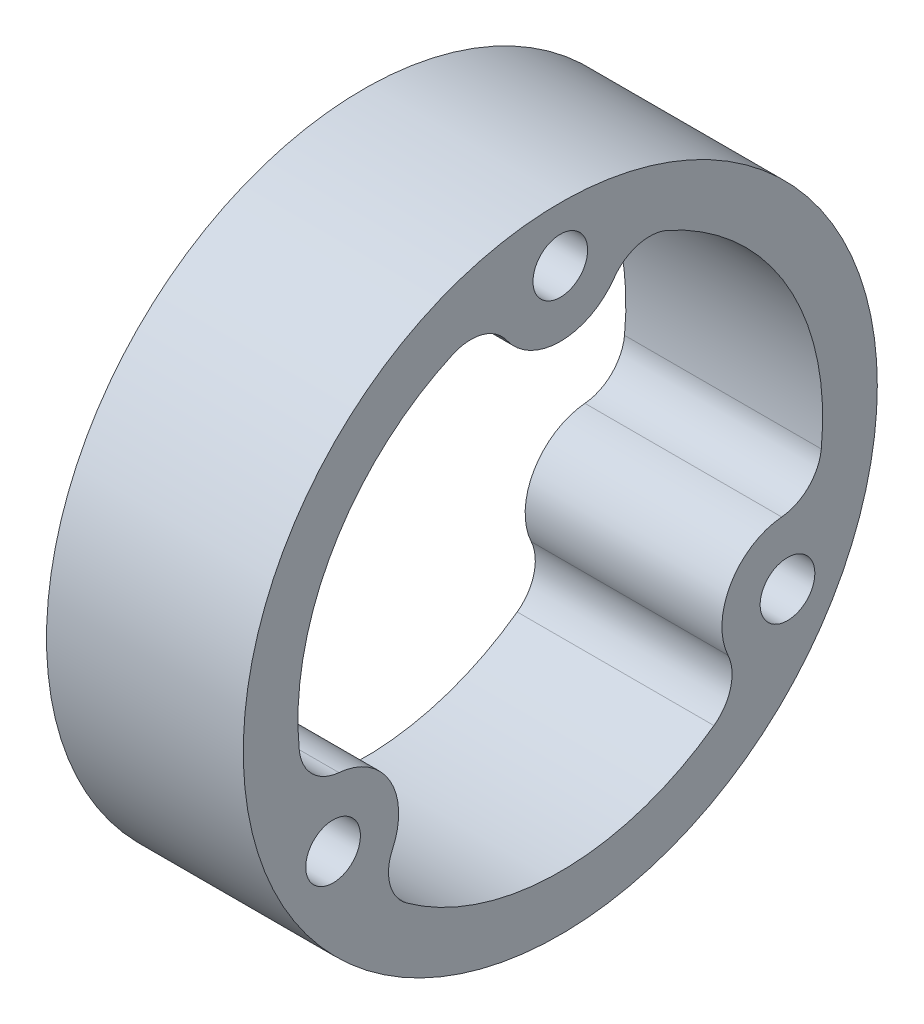
ISO-10303-21;
HEADER;
FILE_DESCRIPTION(('STEP AP214'),'2;1');
FILE_NAME('part.step','',(''),(''),'','','');
FILE_SCHEMA(('AUTOMOTIVE_DESIGN { 1 0 10303 214 1 1 1 1 }'));
ENDSEC;
DATA;
#1=APPLICATION_CONTEXT('core data for automotive mechanical design processes');
#2=APPLICATION_PROTOCOL_DEFINITION('international standard','automotive_design',2000,#1);
#3=PRODUCT_CONTEXT('',#1,'mechanical');
#4=PRODUCT('Part','Part','',(#3));
#5=PRODUCT_RELATED_PRODUCT_CATEGORY('part','',(#4));
#6=PRODUCT_DEFINITION_FORMATION('','',#4);
#7=PRODUCT_DEFINITION_CONTEXT('part definition',#1,'design');
#8=PRODUCT_DEFINITION('design','',#6,#7);
#9=PRODUCT_DEFINITION_SHAPE('','',#8);
#10=(LENGTH_UNIT() NAMED_UNIT(*) SI_UNIT(.MILLI.,.METRE.));
#11=(NAMED_UNIT(*) PLANE_ANGLE_UNIT() SI_UNIT($,.RADIAN.));
#12=(NAMED_UNIT(*) SI_UNIT($,.STERADIAN.) SOLID_ANGLE_UNIT());
#13=UNCERTAINTY_MEASURE_WITH_UNIT(LENGTH_MEASURE(1.E-05),#10,'distance_accuracy_value','');
#14=(GEOMETRIC_REPRESENTATION_CONTEXT(3) GLOBAL_UNCERTAINTY_ASSIGNED_CONTEXT((#13)) GLOBAL_UNIT_ASSIGNED_CONTEXT((#10,
#11,#12)) REPRESENTATION_CONTEXT('',''));
#15=CARTESIAN_POINT('',(0.,0.,0.));
#16=DIRECTION('',(0.,0.,1.));
#17=DIRECTION('',(1.,0.,0.));
#18=AXIS2_PLACEMENT_3D('',#15,#16,#17);
#19=CARTESIAN_POINT('',(9.,0.,0.));
#20=DIRECTION('',(1.,0.,0.));
#21=DIRECTION('',(0.,0.,-1.));
#22=AXIS2_PLACEMENT_3D('',#19,#20,#21);
#23=PLANE('',#22);
#24=CARTESIAN_POINT('',(9.,12.,0.));
#25=DIRECTION('',(1.,0.,0.));
#26=DIRECTION('',(0.,0.,-1.));
#27=AXIS2_PLACEMENT_3D('',#24,#25,#26);
#28=CIRCLE('',#27,1.25);
#29=CARTESIAN_POINT('',(9.,12.,-1.25));
#30=VERTEX_POINT('',#29);
#31=EDGE_CURVE('E233',#30,#30,#28,.T.);
#32=ORIENTED_EDGE('',*,*,#31,.F.);
#33=EDGE_LOOP('',(#32));
#34=FACE_BOUND('',#33,.T.);
#35=CARTESIAN_POINT('',(9.,0.,0.));
#36=DIRECTION('',(1.,0.,0.));
#37=DIRECTION('',(0.,0.,-1.));
#38=AXIS2_PLACEMENT_3D('',#35,#36,#37);
#39=CIRCLE('',#38,14.5);
#40=CARTESIAN_POINT('',(9.,0.,-14.5));
#41=VERTEX_POINT('',#40);
#42=EDGE_CURVE('E149',#41,#41,#39,.T.);
#43=ORIENTED_EDGE('',*,*,#42,.T.);
#44=EDGE_LOOP('',(#43));
#45=FACE_BOUND('',#44,.T.);
#46=CARTESIAN_POINT('',(9.,-6.,-10.3923048454133));
#47=DIRECTION('',(1.,0.,0.));
#48=DIRECTION('',(0.,0.,-1.));
#49=AXIS2_PLACEMENT_3D('',#46,#47,#48);
#50=CIRCLE('',#49,1.25000000000005);
#51=CARTESIAN_POINT('',(9.,-6.,-11.6423048454133));
#52=VERTEX_POINT('',#51);
#53=EDGE_CURVE('E240',#52,#52,#50,.T.);
#54=ORIENTED_EDGE('',*,*,#53,.F.);
#55=EDGE_LOOP('',(#54));
#56=FACE_BOUND('',#55,.T.);
#57=CARTESIAN_POINT('',(9.,12.,0.));
#58=DIRECTION('',(-1.,0.,0.));
#59=DIRECTION('',(0.,0.,-1.));
#60=AXIS2_PLACEMENT_3D('',#57,#58,#59);
#61=CIRCLE('',#60,3.);
#62=CARTESIAN_POINT('',(9.,10.275,-2.45446022579304));
#63=VERTEX_POINT('',#62);
#64=CARTESIAN_POINT('',(9.,10.275,2.45446022579304));
#65=VERTEX_POINT('',#64);
#66=EDGE_CURVE('E226',#63,#65,#61,.T.);
#67=ORIENTED_EDGE('',*,*,#66,.F.);
#68=CARTESIAN_POINT('',(9.,9.125,-4.09076704298839));
#69=DIRECTION('',(1.,0.,0.));
#70=DIRECTION('',(0.,0.,-1.));
#71=AXIS2_PLACEMENT_3D('',#68,#69,#70);
#72=CIRCLE('',#71,2.);
#73=CARTESIAN_POINT('',(9.,10.95,-4.90892045158607));
#74=VERTEX_POINT('',#73);
#75=EDGE_CURVE('E51',#63,#74,#72,.F.);
#76=ORIENTED_EDGE('',*,*,#75,.T.);
#77=CARTESIAN_POINT('',(9.,0.,0.));
#78=DIRECTION('',(1.,0.,0.));
#79=DIRECTION('',(0.,0.,-1.));
#80=AXIS2_PLACEMENT_3D('',#77,#78,#79);
#81=CIRCLE('',#80,12.);
#82=CARTESIAN_POINT('',(9.,-1.22375018376942,-11.9374383972326));
#83=VERTEX_POINT('',#82);
#84=EDGE_CURVE('E239',#83,#74,#81,.T.);
#85=ORIENTED_EDGE('',*,*,#84,.F.);
#86=CARTESIAN_POINT('',(9.,-1.01979181980785,-9.9478653310272));
#87=DIRECTION('',(1.,0.,0.));
#88=DIRECTION('',(0.,0.,-1.));
#89=AXIS2_PLACEMENT_3D('',#86,#87,#88);
#90=CIRCLE('',#89,2.);
#91=CARTESIAN_POINT('',(9.,-3.01187509188469,-10.1256411367816));
#92=VERTEX_POINT('',#91);
#93=EDGE_CURVE('E137',#83,#92,#90,.F.);
#94=ORIENTED_EDGE('',*,*,#93,.T.);
#95=CARTESIAN_POINT('',(9.,-6.,-10.3923048454133));
#96=DIRECTION('',(-1.,0.,0.));
#97=DIRECTION('',(0.,0.,-1.));
#98=AXIS2_PLACEMENT_3D('',#95,#96,#97);
#99=CIRCLE('',#98,3.00000000000005);
#100=CARTESIAN_POINT('',(9.,-7.26312490811529,-7.67118091098855));
#101=VERTEX_POINT('',#100);
#102=EDGE_CURVE('E223',#101,#92,#99,.T.);
#103=ORIENTED_EDGE('',*,*,#102,.F.);
#104=CARTESIAN_POINT('',(9.,-8.10520818019213,-5.85709828803876));
#105=DIRECTION('',(1.,0.,0.));
#106=DIRECTION('',(0.,0.,-1.));
#107=AXIS2_PLACEMENT_3D('',#104,#105,#106);
#108=CIRCLE('',#107,2.);
#109=CARTESIAN_POINT('',(9.,-9.72624981623056,-7.02851794564652));
#110=VERTEX_POINT('',#109);
#111=EDGE_CURVE('E190',#101,#110,#108,.F.);
#112=ORIENTED_EDGE('',*,*,#111,.T.);
#113=CARTESIAN_POINT('',(9.,0.,0.));
#114=DIRECTION('',(1.,0.,0.));
#115=DIRECTION('',(0.,0.,-1.));
#116=AXIS2_PLACEMENT_3D('',#113,#114,#115);
#117=CIRCLE('',#116,12.);
#118=CARTESIAN_POINT('',(9.,-9.7262498162306,7.02851794564646));
#119=VERTEX_POINT('',#118);
#120=EDGE_CURVE('E217',#119,#110,#117,.T.);
#121=ORIENTED_EDGE('',*,*,#120,.F.);
#122=CARTESIAN_POINT('',(9.,-8.10520818019216,5.85709828803872));
#123=DIRECTION('',(1.,0.,0.));
#124=DIRECTION('',(0.,0.,-1.));
#125=AXIS2_PLACEMENT_3D('',#122,#123,#124);
#126=CIRCLE('',#125,2.);
#127=CARTESIAN_POINT('',(9.,-7.26312490811532,7.6711809109885));
#128=VERTEX_POINT('',#127);
#129=EDGE_CURVE('E11',#119,#128,#126,.F.);
#130=ORIENTED_EDGE('',*,*,#129,.T.);
#131=CARTESIAN_POINT('',(9.,-6.00000000000001,10.3923048454133));
#132=DIRECTION('',(-1.,0.,0.));
#133=DIRECTION('',(0.,0.,-1.));
#134=AXIS2_PLACEMENT_3D('',#131,#132,#133);
#135=CIRCLE('',#134,3.00000000000011);
#136=CARTESIAN_POINT('',(9.,-3.01187509188464,10.1256411367816));
#137=VERTEX_POINT('',#136);
#138=EDGE_CURVE('E215',#137,#128,#135,.T.);
#139=ORIENTED_EDGE('',*,*,#138,.F.);
#140=CARTESIAN_POINT('',(9.,-1.0197918198078,9.94786533102721));
#141=DIRECTION('',(1.,0.,0.));
#142=DIRECTION('',(0.,0.,-1.));
#143=AXIS2_PLACEMENT_3D('',#140,#141,#142);
#144=CIRCLE('',#143,2.);
#145=CARTESIAN_POINT('',(9.,-1.22375018376936,11.9374383972327));
#146=VERTEX_POINT('',#145);
#147=EDGE_CURVE('E186',#137,#146,#144,.F.);
#148=ORIENTED_EDGE('',*,*,#147,.T.);
#149=CARTESIAN_POINT('',(9.,0.,0.));
#150=DIRECTION('',(1.,0.,0.));
#151=DIRECTION('',(0.,0.,-1.));
#152=AXIS2_PLACEMENT_3D('',#149,#150,#151);
#153=CIRCLE('',#152,12.);
#154=CARTESIAN_POINT('',(9.,10.95,4.90892045158607));
#155=VERTEX_POINT('',#154);
#156=EDGE_CURVE('E221',#155,#146,#153,.T.);
#157=ORIENTED_EDGE('',*,*,#156,.F.);
#158=CARTESIAN_POINT('',(9.,9.125,4.09076704298839));
#159=DIRECTION('',(1.,0.,0.));
#160=DIRECTION('',(0.,0.,-1.));
#161=AXIS2_PLACEMENT_3D('',#158,#159,#160);
#162=CIRCLE('',#161,2.);
#163=EDGE_CURVE('E182',#155,#65,#162,.F.);
#164=ORIENTED_EDGE('',*,*,#163,.T.);
#165=EDGE_LOOP('',(#67,#76,#85,#94,#103,#112,#121,#130,#139,#148,#157,#164));
#166=FACE_BOUND('',#165,.T.);
#167=CARTESIAN_POINT('',(9.,-6.00000000000001,10.3923048454133));
#168=DIRECTION('',(1.,0.,0.));
#169=DIRECTION('',(0.,0.,-1.));
#170=AXIS2_PLACEMENT_3D('',#167,#168,#169);
#171=CIRCLE('',#170,1.25000000000011);
#172=CARTESIAN_POINT('',(9.,-6.00000000000001,9.14230484541315));
#173=VERTEX_POINT('',#172);
#174=EDGE_CURVE('E419',#173,#173,#171,.T.);
#175=ORIENTED_EDGE('',*,*,#174,.F.);
#176=EDGE_LOOP('',(#175));
#177=FACE_BOUND('',#176,.T.);
#178=ADVANCED_FACE('F36',(#34,#45,#56,#166,#177),#23,.T.);
#179=CARTESIAN_POINT('',(0.,0.,0.));
#180=DIRECTION('',(1.,0.,0.));
#181=DIRECTION('',(0.,0.,-1.));
#182=AXIS2_PLACEMENT_3D('',#179,#180,#181);
#183=PLANE('',#182);
#184=CARTESIAN_POINT('',(0.,-6.,-10.3923048454133));
#185=DIRECTION('',(1.,0.,0.));
#186=DIRECTION('',(0.,0.,-1.));
#187=AXIS2_PLACEMENT_3D('',#184,#185,#186);
#188=CIRCLE('',#187,1.25000000000005);
#189=CARTESIAN_POINT('',(0.,-6.,-11.6423048454133));
#190=VERTEX_POINT('',#189);
#191=EDGE_CURVE('E232',#190,#190,#188,.T.);
#192=ORIENTED_EDGE('',*,*,#191,.T.);
#193=EDGE_LOOP('',(#192));
#194=FACE_BOUND('',#193,.T.);
#195=CARTESIAN_POINT('',(0.,0.,0.));
#196=DIRECTION('',(1.,0.,0.));
#197=DIRECTION('',(0.,0.,-1.));
#198=AXIS2_PLACEMENT_3D('',#195,#196,#197);
#199=CIRCLE('',#198,14.5);
#200=CARTESIAN_POINT('',(0.,0.,-14.5));
#201=VERTEX_POINT('',#200);
#202=EDGE_CURVE('E154',#201,#201,#199,.T.);
#203=ORIENTED_EDGE('',*,*,#202,.F.);
#204=EDGE_LOOP('',(#203));
#205=FACE_BOUND('',#204,.T.);
#206=CARTESIAN_POINT('',(0.,-6.,-10.3923048454133));
#207=DIRECTION('',(-1.,0.,0.));
#208=DIRECTION('',(0.,0.,-1.));
#209=AXIS2_PLACEMENT_3D('',#206,#207,#208);
#210=CIRCLE('',#209,3.00000000000005);
#211=CARTESIAN_POINT('',(0.,-7.26312490811529,-7.67118091098855));
#212=VERTEX_POINT('',#211);
#213=CARTESIAN_POINT('',(0.,-3.01187509188469,-10.1256411367816));
#214=VERTEX_POINT('',#213);
#215=EDGE_CURVE('E209',#212,#214,#210,.T.);
#216=ORIENTED_EDGE('',*,*,#215,.T.);
#217=CARTESIAN_POINT('',(0.,-1.01979181980785,-9.9478653310272));
#218=DIRECTION('',(1.,0.,0.));
#219=DIRECTION('',(0.,0.,-1.));
#220=AXIS2_PLACEMENT_3D('',#217,#218,#219);
#221=CIRCLE('',#220,2.);
#222=CARTESIAN_POINT('',(0.,-1.22375018376942,-11.9374383972326));
#223=VERTEX_POINT('',#222);
#224=EDGE_CURVE('E192',#214,#223,#221,.T.);
#225=ORIENTED_EDGE('',*,*,#224,.T.);
#226=CARTESIAN_POINT('',(0.,0.,0.));
#227=DIRECTION('',(1.,0.,0.));
#228=DIRECTION('',(0.,0.,-1.));
#229=AXIS2_PLACEMENT_3D('',#226,#227,#228);
#230=CIRCLE('',#229,12.);
#231=CARTESIAN_POINT('',(0.,10.95,-4.90892045158607));
#232=VERTEX_POINT('',#231);
#233=EDGE_CURVE('E132',#223,#232,#230,.T.);
#234=ORIENTED_EDGE('',*,*,#233,.T.);
#235=CARTESIAN_POINT('',(0.,9.125,-4.09076704298839));
#236=DIRECTION('',(1.,0.,0.));
#237=DIRECTION('',(0.,0.,-1.));
#238=AXIS2_PLACEMENT_3D('',#235,#236,#237);
#239=CIRCLE('',#238,2.);
#240=CARTESIAN_POINT('',(0.,10.275,-2.45446022579304));
#241=VERTEX_POINT('',#240);
#242=EDGE_CURVE('E126',#232,#241,#239,.T.);
#243=ORIENTED_EDGE('',*,*,#242,.T.);
#244=CARTESIAN_POINT('',(0.,12.,0.));
#245=DIRECTION('',(-1.,0.,0.));
#246=DIRECTION('',(0.,0.,-1.));
#247=AXIS2_PLACEMENT_3D('',#244,#245,#246);
#248=CIRCLE('',#247,3.);
#249=CARTESIAN_POINT('',(0.,10.275,2.45446022579304));
#250=VERTEX_POINT('',#249);
#251=EDGE_CURVE('E131',#241,#250,#248,.T.);
#252=ORIENTED_EDGE('',*,*,#251,.T.);
#253=CARTESIAN_POINT('',(0.,9.125,4.09076704298839));
#254=DIRECTION('',(1.,0.,0.));
#255=DIRECTION('',(0.,0.,-1.));
#256=AXIS2_PLACEMENT_3D('',#253,#254,#255);
#257=CIRCLE('',#256,2.);
#258=CARTESIAN_POINT('',(0.,10.95,4.90892045158607));
#259=VERTEX_POINT('',#258);
#260=EDGE_CURVE('E180',#250,#259,#257,.T.);
#261=ORIENTED_EDGE('',*,*,#260,.T.);
#262=CARTESIAN_POINT('',(0.,0.,0.));
#263=DIRECTION('',(1.,0.,0.));
#264=DIRECTION('',(0.,0.,-1.));
#265=AXIS2_PLACEMENT_3D('',#262,#263,#264);
#266=CIRCLE('',#265,12.);
#267=CARTESIAN_POINT('',(0.,-1.22375018376936,11.9374383972327));
#268=VERTEX_POINT('',#267);
#269=EDGE_CURVE('E146',#259,#268,#266,.T.);
#270=ORIENTED_EDGE('',*,*,#269,.T.);
#271=CARTESIAN_POINT('',(0.,-1.0197918198078,9.94786533102721));
#272=DIRECTION('',(1.,0.,0.));
#273=DIRECTION('',(0.,0.,-1.));
#274=AXIS2_PLACEMENT_3D('',#271,#272,#273);
#275=CIRCLE('',#274,2.);
#276=CARTESIAN_POINT('',(0.,-3.01187509188464,10.1256411367816));
#277=VERTEX_POINT('',#276);
#278=EDGE_CURVE('E184',#268,#277,#275,.T.);
#279=ORIENTED_EDGE('',*,*,#278,.T.);
#280=CARTESIAN_POINT('',(0.,-6.00000000000001,10.3923048454133));
#281=DIRECTION('',(-1.,0.,0.));
#282=DIRECTION('',(0.,0.,-1.));
#283=AXIS2_PLACEMENT_3D('',#280,#281,#282);
#284=CIRCLE('',#283,3.00000000000011);
#285=CARTESIAN_POINT('',(0.,-7.26312490811532,7.6711809109885));
#286=VERTEX_POINT('',#285);
#287=EDGE_CURVE('E200',#277,#286,#284,.T.);
#288=ORIENTED_EDGE('',*,*,#287,.T.);
#289=CARTESIAN_POINT('',(0.,-8.10520818019216,5.85709828803872));
#290=DIRECTION('',(1.,0.,0.));
#291=DIRECTION('',(0.,0.,-1.));
#292=AXIS2_PLACEMENT_3D('',#289,#290,#291);
#293=CIRCLE('',#292,2.);
#294=CARTESIAN_POINT('',(0.,-9.7262498162306,7.02851794564646));
#295=VERTEX_POINT('',#294);
#296=EDGE_CURVE('E44',#286,#295,#293,.T.);
#297=ORIENTED_EDGE('',*,*,#296,.T.);
#298=CARTESIAN_POINT('',(0.,0.,0.));
#299=DIRECTION('',(1.,0.,0.));
#300=DIRECTION('',(0.,0.,-1.));
#301=AXIS2_PLACEMENT_3D('',#298,#299,#300);
#302=CIRCLE('',#301,12.);
#303=CARTESIAN_POINT('',(0.,-9.72624981623056,-7.02851794564652));
#304=VERTEX_POINT('',#303);
#305=EDGE_CURVE('E198',#295,#304,#302,.T.);
#306=ORIENTED_EDGE('',*,*,#305,.T.);
#307=CARTESIAN_POINT('',(0.,-8.10520818019213,-5.85709828803876));
#308=DIRECTION('',(1.,0.,0.));
#309=DIRECTION('',(0.,0.,-1.));
#310=AXIS2_PLACEMENT_3D('',#307,#308,#309);
#311=CIRCLE('',#310,2.);
#312=EDGE_CURVE('E188',#304,#212,#311,.T.);
#313=ORIENTED_EDGE('',*,*,#312,.T.);
#314=EDGE_LOOP('',(#216,#225,#234,#243,#252,#261,#270,#279,#288,#297,#306,#313));
#315=FACE_BOUND('',#314,.T.);
#316=CARTESIAN_POINT('',(0.,12.,0.));
#317=DIRECTION('',(1.,0.,0.));
#318=DIRECTION('',(0.,0.,-1.));
#319=AXIS2_PLACEMENT_3D('',#316,#317,#318);
#320=CIRCLE('',#319,1.25);
#321=CARTESIAN_POINT('',(0.,12.,-1.25));
#322=VERTEX_POINT('',#321);
#323=EDGE_CURVE('E418',#322,#322,#320,.T.);
#324=ORIENTED_EDGE('',*,*,#323,.T.);
#325=EDGE_LOOP('',(#324));
#326=FACE_BOUND('',#325,.T.);
#327=CARTESIAN_POINT('',(0.,-6.00000000000001,10.3923048454133));
#328=DIRECTION('',(1.,0.,0.));
#329=DIRECTION('',(0.,0.,-1.));
#330=AXIS2_PLACEMENT_3D('',#327,#328,#329);
#331=CIRCLE('',#330,1.25000000000011);
#332=CARTESIAN_POINT('',(0.,-6.00000000000001,9.14230484541315));
#333=VERTEX_POINT('',#332);
#334=EDGE_CURVE('E423',#333,#333,#331,.T.);
#335=ORIENTED_EDGE('',*,*,#334,.T.);
#336=EDGE_LOOP('',(#335));
#337=FACE_BOUND('',#336,.T.);
#338=ADVANCED_FACE('F129',(#194,#205,#315,#326,#337),#183,.F.);
#339=CARTESIAN_POINT('',(9.,0.,0.));
#340=DIRECTION('',(-1.,0.,0.));
#341=DIRECTION('',(0.,0.,1.));
#342=AXIS2_PLACEMENT_3D('',#339,#340,#341);
#343=CYLINDRICAL_SURFACE('',#342,14.5);
#344=ORIENTED_EDGE('',*,*,#42,.F.);
#345=EDGE_LOOP('',(#344));
#346=FACE_BOUND('',#345,.T.);
#347=ORIENTED_EDGE('',*,*,#202,.T.);
#348=EDGE_LOOP('',(#347));
#349=FACE_BOUND('',#348,.T.);
#350=ADVANCED_FACE('F251',(#346,#349),#343,.T.);
#351=CARTESIAN_POINT('',(9.,-6.,-10.3923048454133));
#352=DIRECTION('',(-1.,0.,0.));
#353=DIRECTION('',(0.,0.,1.));
#354=AXIS2_PLACEMENT_3D('',#351,#352,#353);
#355=CYLINDRICAL_SURFACE('',#354,1.25000000000005);
#356=ORIENTED_EDGE('',*,*,#53,.T.);
#357=EDGE_LOOP('',(#356));
#358=FACE_BOUND('',#357,.T.);
#359=ORIENTED_EDGE('',*,*,#191,.F.);
#360=EDGE_LOOP('',(#359));
#361=FACE_BOUND('',#360,.T.);
#362=ADVANCED_FACE('F248',(#358,#361),#355,.F.);
#363=CARTESIAN_POINT('',(9.,0.,0.));
#364=DIRECTION('',(-1.,0.,0.));
#365=DIRECTION('',(0.,0.,1.));
#366=AXIS2_PLACEMENT_3D('',#363,#364,#365);
#367=CYLINDRICAL_SURFACE('',#366,12.);
#368=ORIENTED_EDGE('',*,*,#233,.F.);
#369=DIRECTION('',(-1.,0.,0.));
#370=VECTOR('',#369,1.);
#371=CARTESIAN_POINT('',(9.,-1.22375018376942,-11.9374383972326));
#372=LINE('',#371,#370);
#373=EDGE_CURVE('E58',#223,#83,#372,.F.);
#374=ORIENTED_EDGE('',*,*,#373,.T.);
#375=ORIENTED_EDGE('',*,*,#84,.T.);
#376=DIRECTION('',(-1.,0.,0.));
#377=VECTOR('',#376,1.);
#378=CARTESIAN_POINT('',(9.,10.95,-4.90892045158607));
#379=LINE('',#378,#377);
#380=EDGE_CURVE('E177',#74,#232,#379,.T.);
#381=ORIENTED_EDGE('',*,*,#380,.T.);
#382=EDGE_LOOP('',(#368,#374,#375,#381));
#383=FACE_BOUND('',#382,.T.);
#384=ADVANCED_FACE('F250',(#383),#367,.F.);
#385=CARTESIAN_POINT('',(9.,12.,0.));
#386=DIRECTION('',(-1.,0.,0.));
#387=DIRECTION('',(0.,0.,1.));
#388=AXIS2_PLACEMENT_3D('',#385,#386,#387);
#389=CYLINDRICAL_SURFACE('',#388,3.);
#390=ORIENTED_EDGE('',*,*,#66,.T.);
#391=DIRECTION('',(-1.,0.,0.));
#392=VECTOR('',#391,1.);
#393=CARTESIAN_POINT('',(9.,10.275,2.45446022579304));
#394=LINE('',#393,#392);
#395=EDGE_CURVE('E145',#65,#250,#394,.T.);
#396=ORIENTED_EDGE('',*,*,#395,.T.);
#397=ORIENTED_EDGE('',*,*,#251,.F.);
#398=DIRECTION('',(-1.,0.,0.));
#399=VECTOR('',#398,1.);
#400=CARTESIAN_POINT('',(9.,10.275,-2.45446022579304));
#401=LINE('',#400,#399);
#402=EDGE_CURVE('E143',#241,#63,#401,.F.);
#403=ORIENTED_EDGE('',*,*,#402,.T.);
#404=EDGE_LOOP('',(#390,#396,#397,#403));
#405=FACE_BOUND('',#404,.T.);
#406=ADVANCED_FACE('F142',(#405),#389,.T.);
#407=CARTESIAN_POINT('',(9.,0.,0.));
#408=DIRECTION('',(-1.,0.,0.));
#409=DIRECTION('',(0.,0.,1.));
#410=AXIS2_PLACEMENT_3D('',#407,#408,#409);
#411=CYLINDRICAL_SURFACE('',#410,12.);
#412=ORIENTED_EDGE('',*,*,#269,.F.);
#413=DIRECTION('',(-1.,0.,0.));
#414=VECTOR('',#413,1.);
#415=CARTESIAN_POINT('',(9.,10.95,4.90892045158607));
#416=LINE('',#415,#414);
#417=EDGE_CURVE('E160',#259,#155,#416,.F.);
#418=ORIENTED_EDGE('',*,*,#417,.T.);
#419=ORIENTED_EDGE('',*,*,#156,.T.);
#420=DIRECTION('',(-1.,0.,0.));
#421=VECTOR('',#420,1.);
#422=CARTESIAN_POINT('',(9.,-1.22375018376936,11.9374383972327));
#423=LINE('',#422,#421);
#424=EDGE_CURVE('E151',#146,#268,#423,.T.);
#425=ORIENTED_EDGE('',*,*,#424,.T.);
#426=EDGE_LOOP('',(#412,#418,#419,#425));
#427=FACE_BOUND('',#426,.T.);
#428=ADVANCED_FACE('F353',(#427),#411,.F.);
#429=CARTESIAN_POINT('',(9.,-6.00000000000001,10.3923048454133));
#430=DIRECTION('',(-1.,0.,0.));
#431=DIRECTION('',(0.,0.,1.));
#432=AXIS2_PLACEMENT_3D('',#429,#430,#431);
#433=CYLINDRICAL_SURFACE('',#432,3.00000000000011);
#434=ORIENTED_EDGE('',*,*,#287,.F.);
#435=DIRECTION('',(-1.,0.,0.));
#436=VECTOR('',#435,1.);
#437=CARTESIAN_POINT('',(9.,-3.01187509188464,10.1256411367816));
#438=LINE('',#437,#436);
#439=EDGE_CURVE('E165',#277,#137,#438,.F.);
#440=ORIENTED_EDGE('',*,*,#439,.T.);
#441=ORIENTED_EDGE('',*,*,#138,.T.);
#442=DIRECTION('',(-1.,0.,0.));
#443=VECTOR('',#442,1.);
#444=CARTESIAN_POINT('',(9.,-7.26312490811532,7.6711809109885));
#445=LINE('',#444,#443);
#446=EDGE_CURVE('E162',#128,#286,#445,.T.);
#447=ORIENTED_EDGE('',*,*,#446,.T.);
#448=EDGE_LOOP('',(#434,#440,#441,#447));
#449=FACE_BOUND('',#448,.T.);
#450=ADVANCED_FACE('F219',(#449),#433,.T.);
#451=CARTESIAN_POINT('',(9.,0.,0.));
#452=DIRECTION('',(-1.,0.,0.));
#453=DIRECTION('',(0.,0.,1.));
#454=AXIS2_PLACEMENT_3D('',#451,#452,#453);
#455=CYLINDRICAL_SURFACE('',#454,12.);
#456=ORIENTED_EDGE('',*,*,#120,.T.);
#457=DIRECTION('',(-1.,0.,0.));
#458=VECTOR('',#457,1.);
#459=CARTESIAN_POINT('',(9.,-9.72624981623056,-7.02851794564652));
#460=LINE('',#459,#458);
#461=EDGE_CURVE('E169',#110,#304,#460,.T.);
#462=ORIENTED_EDGE('',*,*,#461,.T.);
#463=ORIENTED_EDGE('',*,*,#305,.F.);
#464=DIRECTION('',(-1.,0.,0.));
#465=VECTOR('',#464,1.);
#466=CARTESIAN_POINT('',(9.,-9.7262498162306,7.02851794564646));
#467=LINE('',#466,#465);
#468=EDGE_CURVE('E167',#295,#119,#467,.F.);
#469=ORIENTED_EDGE('',*,*,#468,.T.);
#470=EDGE_LOOP('',(#456,#462,#463,#469));
#471=FACE_BOUND('',#470,.T.);
#472=ADVANCED_FACE('F206',(#471),#455,.F.);
#473=CARTESIAN_POINT('',(9.,-6.,-10.3923048454133));
#474=DIRECTION('',(-1.,0.,0.));
#475=DIRECTION('',(0.,0.,1.));
#476=AXIS2_PLACEMENT_3D('',#473,#474,#475);
#477=CYLINDRICAL_SURFACE('',#476,3.00000000000005);
#478=ORIENTED_EDGE('',*,*,#215,.F.);
#479=DIRECTION('',(-1.,0.,0.));
#480=VECTOR('',#479,1.);
#481=CARTESIAN_POINT('',(9.,-7.26312490811529,-7.67118091098854));
#482=LINE('',#481,#480);
#483=EDGE_CURVE('E175',#212,#101,#482,.F.);
#484=ORIENTED_EDGE('',*,*,#483,.T.);
#485=ORIENTED_EDGE('',*,*,#102,.T.);
#486=DIRECTION('',(-1.,0.,0.));
#487=VECTOR('',#486,1.);
#488=CARTESIAN_POINT('',(9.,-3.01187509188469,-10.1256411367816));
#489=LINE('',#488,#487);
#490=EDGE_CURVE('E172',#92,#214,#489,.T.);
#491=ORIENTED_EDGE('',*,*,#490,.T.);
#492=EDGE_LOOP('',(#478,#484,#485,#491));
#493=FACE_BOUND('',#492,.T.);
#494=ADVANCED_FACE('F328',(#493),#477,.T.);
#495=CARTESIAN_POINT('',(9.,12.,0.));
#496=DIRECTION('',(-1.,0.,0.));
#497=DIRECTION('',(0.,0.,1.));
#498=AXIS2_PLACEMENT_3D('',#495,#496,#497);
#499=CYLINDRICAL_SURFACE('',#498,1.25);
#500=ORIENTED_EDGE('',*,*,#31,.T.);
#501=EDGE_LOOP('',(#500));
#502=FACE_BOUND('',#501,.T.);
#503=ORIENTED_EDGE('',*,*,#323,.F.);
#504=EDGE_LOOP('',(#503));
#505=FACE_BOUND('',#504,.T.);
#506=ADVANCED_FACE('F333',(#502,#505),#499,.F.);
#507=CARTESIAN_POINT('',(9.,-6.00000000000001,10.3923048454133));
#508=DIRECTION('',(-1.,0.,0.));
#509=DIRECTION('',(0.,0.,1.));
#510=AXIS2_PLACEMENT_3D('',#507,#508,#509);
#511=CYLINDRICAL_SURFACE('',#510,1.25000000000011);
#512=ORIENTED_EDGE('',*,*,#174,.T.);
#513=EDGE_LOOP('',(#512));
#514=FACE_BOUND('',#513,.T.);
#515=ORIENTED_EDGE('',*,*,#334,.F.);
#516=EDGE_LOOP('',(#515));
#517=FACE_BOUND('',#516,.T.);
#518=ADVANCED_FACE('F275',(#514,#517),#511,.F.);
#519=CARTESIAN_POINT('',(9.,9.125,4.09076704298839));
#520=DIRECTION('',(-1.,0.,0.));
#521=DIRECTION('',(0.,0.,1.));
#522=AXIS2_PLACEMENT_3D('',#519,#520,#521);
#523=CYLINDRICAL_SURFACE('',#522,2.);
#524=ORIENTED_EDGE('',*,*,#163,.F.);
#525=ORIENTED_EDGE('',*,*,#417,.F.);
#526=ORIENTED_EDGE('',*,*,#260,.F.);
#527=ORIENTED_EDGE('',*,*,#395,.F.);
#528=EDGE_LOOP('',(#524,#525,#526,#527));
#529=FACE_BOUND('',#528,.T.);
#530=ADVANCED_FACE('F271',(#529),#523,.F.);
#531=CARTESIAN_POINT('',(9.,-1.0197918198078,9.94786533102721));
#532=DIRECTION('',(-1.,0.,0.));
#533=DIRECTION('',(0.,0.,1.));
#534=AXIS2_PLACEMENT_3D('',#531,#532,#533);
#535=CYLINDRICAL_SURFACE('',#534,2.);
#536=ORIENTED_EDGE('',*,*,#147,.F.);
#537=ORIENTED_EDGE('',*,*,#439,.F.);
#538=ORIENTED_EDGE('',*,*,#278,.F.);
#539=ORIENTED_EDGE('',*,*,#424,.F.);
#540=EDGE_LOOP('',(#536,#537,#538,#539));
#541=FACE_BOUND('',#540,.T.);
#542=ADVANCED_FACE('F274',(#541),#535,.F.);
#543=CARTESIAN_POINT('',(9.,-8.10520818019213,-5.85709828803876));
#544=DIRECTION('',(-1.,0.,0.));
#545=DIRECTION('',(0.,0.,1.));
#546=AXIS2_PLACEMENT_3D('',#543,#544,#545);
#547=CYLINDRICAL_SURFACE('',#546,2.);
#548=ORIENTED_EDGE('',*,*,#111,.F.);
#549=ORIENTED_EDGE('',*,*,#483,.F.);
#550=ORIENTED_EDGE('',*,*,#312,.F.);
#551=ORIENTED_EDGE('',*,*,#461,.F.);
#552=EDGE_LOOP('',(#548,#549,#550,#551));
#553=FACE_BOUND('',#552,.T.);
#554=ADVANCED_FACE('F279',(#553),#547,.F.);
#555=CARTESIAN_POINT('',(9.,-1.01979181980785,-9.9478653310272));
#556=DIRECTION('',(-1.,0.,0.));
#557=DIRECTION('',(0.,0.,1.));
#558=AXIS2_PLACEMENT_3D('',#555,#556,#557);
#559=CYLINDRICAL_SURFACE('',#558,2.);
#560=ORIENTED_EDGE('',*,*,#93,.F.);
#561=ORIENTED_EDGE('',*,*,#373,.F.);
#562=ORIENTED_EDGE('',*,*,#224,.F.);
#563=ORIENTED_EDGE('',*,*,#490,.F.);
#564=EDGE_LOOP('',(#560,#561,#562,#563));
#565=FACE_BOUND('',#564,.T.);
#566=ADVANCED_FACE('F283',(#565),#559,.F.);
#567=CARTESIAN_POINT('',(9.,9.125,-4.09076704298839));
#568=DIRECTION('',(-1.,0.,0.));
#569=DIRECTION('',(0.,0.,1.));
#570=AXIS2_PLACEMENT_3D('',#567,#568,#569);
#571=CYLINDRICAL_SURFACE('',#570,2.);
#572=ORIENTED_EDGE('',*,*,#75,.F.);
#573=ORIENTED_EDGE('',*,*,#402,.F.);
#574=ORIENTED_EDGE('',*,*,#242,.F.);
#575=ORIENTED_EDGE('',*,*,#380,.F.);
#576=EDGE_LOOP('',(#572,#573,#574,#575));
#577=FACE_BOUND('',#576,.T.);
#578=ADVANCED_FACE('F148',(#577),#571,.F.);
#579=CARTESIAN_POINT('',(9.,-8.10520818019216,5.85709828803872));
#580=DIRECTION('',(-1.,0.,0.));
#581=DIRECTION('',(0.,0.,1.));
#582=AXIS2_PLACEMENT_3D('',#579,#580,#581);
#583=CYLINDRICAL_SURFACE('',#582,2.);
#584=ORIENTED_EDGE('',*,*,#129,.F.);
#585=ORIENTED_EDGE('',*,*,#468,.F.);
#586=ORIENTED_EDGE('',*,*,#296,.F.);
#587=ORIENTED_EDGE('',*,*,#446,.F.);
#588=EDGE_LOOP('',(#584,#585,#586,#587));
#589=FACE_BOUND('',#588,.T.);
#590=ADVANCED_FACE('F38',(#589),#583,.F.);
#591=CLOSED_SHELL('',(#178,#338,#350,#362,#384,#406,#428,#450,#472,#494,#506,#518,#530,#542,
#554,#566,#578,#590));
#592=MANIFOLD_SOLID_BREP('B2',#591);
#593=ADVANCED_BREP_SHAPE_REPRESENTATION('',(#18,#592),#14);
#594=SHAPE_DEFINITION_REPRESENTATION(#9,#593);
ENDSEC;
END-ISO-10303-21;
